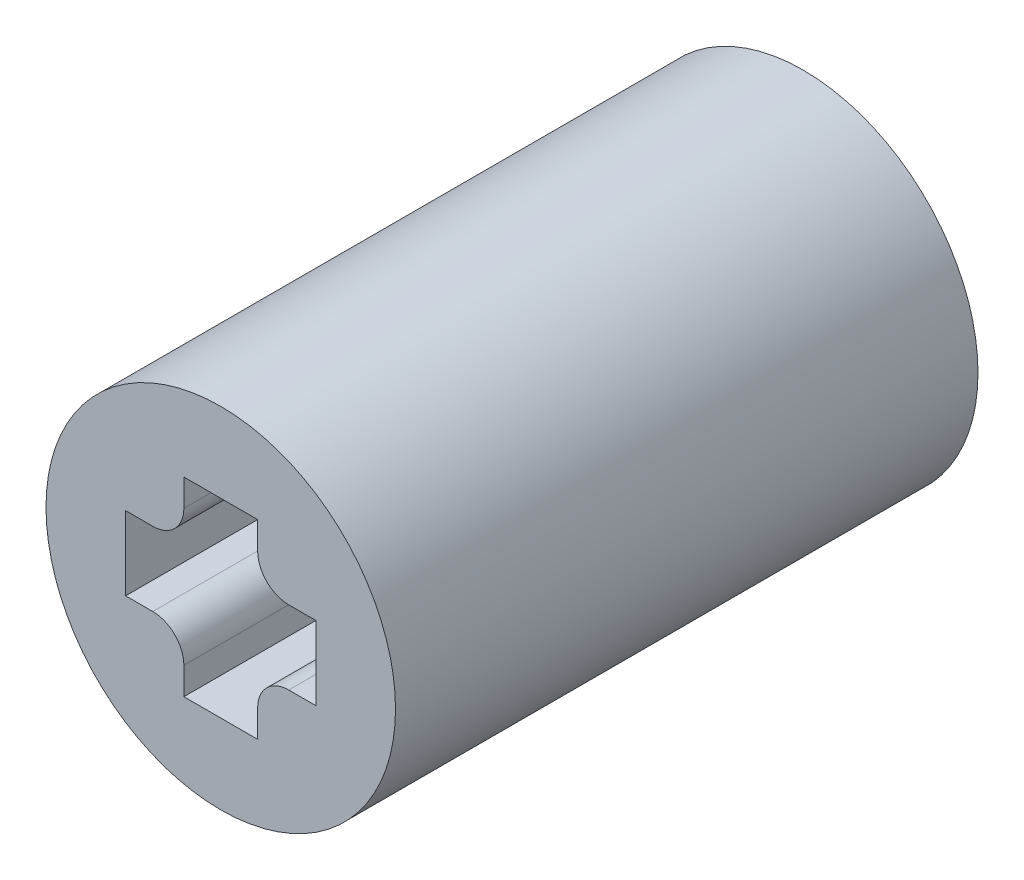
ISO-10303-21;
HEADER;
FILE_DESCRIPTION(('STEP AP214'),'2;1');
FILE_NAME('part.step','',(''),(''),'','','');
FILE_SCHEMA(('AUTOMOTIVE_DESIGN { 1 0 10303 214 1 1 1 1 }'));
ENDSEC;
DATA;
#1=APPLICATION_CONTEXT('core data for automotive mechanical design processes');
#2=APPLICATION_PROTOCOL_DEFINITION('international standard','automotive_design',2000,#1);
#3=PRODUCT_CONTEXT('',#1,'mechanical');
#4=PRODUCT('Part','Part','',(#3));
#5=PRODUCT_RELATED_PRODUCT_CATEGORY('part','',(#4));
#6=PRODUCT_DEFINITION_FORMATION('','',#4);
#7=PRODUCT_DEFINITION_CONTEXT('part definition',#1,'design');
#8=PRODUCT_DEFINITION('design','',#6,#7);
#9=PRODUCT_DEFINITION_SHAPE('','',#8);
#10=(LENGTH_UNIT() NAMED_UNIT(*) SI_UNIT(.MILLI.,.METRE.));
#11=(NAMED_UNIT(*) PLANE_ANGLE_UNIT() SI_UNIT($,.RADIAN.));
#12=(NAMED_UNIT(*) SI_UNIT($,.STERADIAN.) SOLID_ANGLE_UNIT());
#13=UNCERTAINTY_MEASURE_WITH_UNIT(LENGTH_MEASURE(1.E-05),#10,'distance_accuracy_value','');
#14=(GEOMETRIC_REPRESENTATION_CONTEXT(3) GLOBAL_UNCERTAINTY_ASSIGNED_CONTEXT((#13)) GLOBAL_UNIT_ASSIGNED_CONTEXT((#10,
#11,#12)) REPRESENTATION_CONTEXT('',''));
#15=CARTESIAN_POINT('',(0.,0.,0.));
#16=DIRECTION('',(0.,0.,1.));
#17=DIRECTION('',(1.,0.,0.));
#18=AXIS2_PLACEMENT_3D('',#15,#16,#17);
#19=CARTESIAN_POINT('',(0.,0.,15.));
#20=DIRECTION('',(0.,0.,-1.));
#21=DIRECTION('',(-1.,0.,0.));
#22=AXIS2_PLACEMENT_3D('',#19,#20,#21);
#23=CYLINDRICAL_SURFACE('',#22,4.5);
#24=CARTESIAN_POINT('',(0.,0.,15.));
#25=DIRECTION('',(0.,0.,1.));
#26=DIRECTION('',(1.,0.,0.));
#27=AXIS2_PLACEMENT_3D('',#24,#25,#26);
#28=CIRCLE('',#27,4.5);
#29=CARTESIAN_POINT('',(4.5,0.,15.));
#30=VERTEX_POINT('',#29);
#31=EDGE_CURVE('E297',#30,#30,#28,.T.);
#32=ORIENTED_EDGE('',*,*,#31,.F.);
#33=EDGE_LOOP('',(#32));
#34=FACE_BOUND('',#33,.T.);
#35=CARTESIAN_POINT('',(0.,0.,0.));
#36=DIRECTION('',(0.,0.,1.));
#37=DIRECTION('',(1.,0.,0.));
#38=AXIS2_PLACEMENT_3D('',#35,#36,#37);
#39=CIRCLE('',#38,4.5);
#40=CARTESIAN_POINT('',(4.5,0.,0.));
#41=VERTEX_POINT('',#40);
#42=EDGE_CURVE('E290',#41,#41,#39,.T.);
#43=ORIENTED_EDGE('',*,*,#42,.T.);
#44=EDGE_LOOP('',(#43));
#45=FACE_BOUND('',#44,.T.);
#46=ADVANCED_FACE('F33',(#34,#45),#23,.T.);
#47=CARTESIAN_POINT('',(0.,0.,15.));
#48=DIRECTION('',(0.,0.,1.));
#49=DIRECTION('',(1.,0.,0.));
#50=AXIS2_PLACEMENT_3D('',#47,#48,#49);
#51=PLANE('',#50);
#52=DIRECTION('',(0.,-1.,0.));
#53=VECTOR('',#52,1.);
#54=CARTESIAN_POINT('',(-0.949999999999999,-0.95,15.));
#55=LINE('',#54,#53);
#56=CARTESIAN_POINT('',(-0.949999999999999,-1.75,15.));
#57=VERTEX_POINT('',#56);
#58=CARTESIAN_POINT('',(-0.949999999999999,-2.45,15.));
#59=VERTEX_POINT('',#58);
#60=EDGE_CURVE('E241',#57,#59,#55,.T.);
#61=ORIENTED_EDGE('',*,*,#60,.F.);
#62=CARTESIAN_POINT('',(-1.75,-1.75,15.));
#63=DIRECTION('',(0.,0.,1.));
#64=DIRECTION('',(1.,0.,0.));
#65=AXIS2_PLACEMENT_3D('',#62,#63,#64);
#66=CIRCLE('',#65,0.8);
#67=CARTESIAN_POINT('',(-1.75,-0.95,15.));
#68=VERTEX_POINT('',#67);
#69=EDGE_CURVE('E311',#57,#68,#66,.T.);
#70=ORIENTED_EDGE('',*,*,#69,.T.);
#71=DIRECTION('',(1.,0.,0.));
#72=VECTOR('',#71,1.);
#73=CARTESIAN_POINT('',(-2.45,-0.95,15.));
#74=LINE('',#73,#72);
#75=CARTESIAN_POINT('',(-2.45,-0.95,15.));
#76=VERTEX_POINT('',#75);
#77=EDGE_CURVE('E238',#76,#68,#74,.T.);
#78=ORIENTED_EDGE('',*,*,#77,.F.);
#79=DIRECTION('',(0.,-1.,0.));
#80=VECTOR('',#79,1.);
#81=CARTESIAN_POINT('',(-2.45,0.95,15.));
#82=LINE('',#81,#80);
#83=CARTESIAN_POINT('',(-2.45,0.95,15.));
#84=VERTEX_POINT('',#83);
#85=EDGE_CURVE('E235',#84,#76,#82,.T.);
#86=ORIENTED_EDGE('',*,*,#85,.F.);
#87=DIRECTION('',(-1.,0.,0.));
#88=VECTOR('',#87,1.);
#89=CARTESIAN_POINT('',(-2.45,0.95,15.));
#90=LINE('',#89,#88);
#91=CARTESIAN_POINT('',(-1.75,0.95,15.));
#92=VERTEX_POINT('',#91);
#93=EDGE_CURVE('E233',#92,#84,#90,.T.);
#94=ORIENTED_EDGE('',*,*,#93,.F.);
#95=CARTESIAN_POINT('',(-1.75,1.75,15.));
#96=DIRECTION('',(0.,0.,1.));
#97=DIRECTION('',(1.,0.,0.));
#98=AXIS2_PLACEMENT_3D('',#95,#96,#97);
#99=CIRCLE('',#98,0.8);
#100=CARTESIAN_POINT('',(-0.949999999999999,1.75,15.));
#101=VERTEX_POINT('',#100);
#102=EDGE_CURVE('E307',#92,#101,#99,.T.);
#103=ORIENTED_EDGE('',*,*,#102,.T.);
#104=DIRECTION('',(0.,-1.,0.));
#105=VECTOR('',#104,1.);
#106=CARTESIAN_POINT('',(-0.949999999999999,2.45,15.));
#107=LINE('',#106,#105);
#108=CARTESIAN_POINT('',(-0.949999999999999,2.45,15.));
#109=VERTEX_POINT('',#108);
#110=EDGE_CURVE('E230',#109,#101,#107,.T.);
#111=ORIENTED_EDGE('',*,*,#110,.F.);
#112=DIRECTION('',(-1.,0.,0.));
#113=VECTOR('',#112,1.);
#114=CARTESIAN_POINT('',(-0.949999999999999,2.45,15.));
#115=LINE('',#114,#113);
#116=CARTESIAN_POINT('',(0.950000000000001,2.45,15.));
#117=VERTEX_POINT('',#116);
#118=EDGE_CURVE('E227',#117,#109,#115,.T.);
#119=ORIENTED_EDGE('',*,*,#118,.F.);
#120=DIRECTION('',(0.,1.,0.));
#121=VECTOR('',#120,1.);
#122=CARTESIAN_POINT('',(0.950000000000001,2.45,15.));
#123=LINE('',#122,#121);
#124=CARTESIAN_POINT('',(0.950000000000001,1.75,15.));
#125=VERTEX_POINT('',#124);
#126=EDGE_CURVE('E225',#125,#117,#123,.T.);
#127=ORIENTED_EDGE('',*,*,#126,.F.);
#128=CARTESIAN_POINT('',(1.75,1.75,15.));
#129=DIRECTION('',(0.,0.,1.));
#130=DIRECTION('',(1.,0.,0.));
#131=AXIS2_PLACEMENT_3D('',#128,#129,#130);
#132=CIRCLE('',#131,0.8);
#133=CARTESIAN_POINT('',(1.75,0.95,15.));
#134=VERTEX_POINT('',#133);
#135=EDGE_CURVE('E305',#125,#134,#132,.T.);
#136=ORIENTED_EDGE('',*,*,#135,.T.);
#137=DIRECTION('',(-1.,0.,0.));
#138=VECTOR('',#137,1.);
#139=CARTESIAN_POINT('',(0.950000000000001,0.95,15.));
#140=LINE('',#139,#138);
#141=CARTESIAN_POINT('',(2.45,0.95,15.));
#142=VERTEX_POINT('',#141);
#143=EDGE_CURVE('E223',#142,#134,#140,.T.);
#144=ORIENTED_EDGE('',*,*,#143,.F.);
#145=DIRECTION('',(0.,1.,0.));
#146=VECTOR('',#145,1.);
#147=CARTESIAN_POINT('',(2.45,0.95,15.));
#148=LINE('',#147,#146);
#149=CARTESIAN_POINT('',(2.45,-0.95,15.));
#150=VERTEX_POINT('',#149);
#151=EDGE_CURVE('E221',#150,#142,#148,.T.);
#152=ORIENTED_EDGE('',*,*,#151,.F.);
#153=DIRECTION('',(1.,0.,0.));
#154=VECTOR('',#153,1.);
#155=CARTESIAN_POINT('',(0.950000000000001,-0.95,15.));
#156=LINE('',#155,#154);
#157=CARTESIAN_POINT('',(1.75,-0.95,15.));
#158=VERTEX_POINT('',#157);
#159=EDGE_CURVE('E186',#158,#150,#156,.T.);
#160=ORIENTED_EDGE('',*,*,#159,.F.);
#161=CARTESIAN_POINT('',(1.75,-1.75,15.));
#162=DIRECTION('',(0.,0.,1.));
#163=DIRECTION('',(1.,0.,0.));
#164=AXIS2_PLACEMENT_3D('',#161,#162,#163);
#165=CIRCLE('',#164,0.8);
#166=CARTESIAN_POINT('',(0.950000000000001,-1.75,15.));
#167=VERTEX_POINT('',#166);
#168=EDGE_CURVE('E309',#158,#167,#165,.T.);
#169=ORIENTED_EDGE('',*,*,#168,.T.);
#170=DIRECTION('',(0.,1.,0.));
#171=VECTOR('',#170,1.);
#172=CARTESIAN_POINT('',(0.950000000000001,-0.95,15.));
#173=LINE('',#172,#171);
#174=CARTESIAN_POINT('',(0.950000000000002,-2.45,15.));
#175=VERTEX_POINT('',#174);
#176=EDGE_CURVE('E180',#175,#167,#173,.T.);
#177=ORIENTED_EDGE('',*,*,#176,.F.);
#178=DIRECTION('',(1.,0.,0.));
#179=VECTOR('',#178,1.);
#180=CARTESIAN_POINT('',(-0.949999999999999,-2.45,15.));
#181=LINE('',#180,#179);
#182=EDGE_CURVE('E243',#59,#175,#181,.T.);
#183=ORIENTED_EDGE('',*,*,#182,.F.);
#184=EDGE_LOOP('',(#61,#70,#78,#86,#94,#103,#111,#119,#127,#136,#144,#152,#160,#169,#177,#183));
#185=FACE_BOUND('',#184,.T.);
#186=ORIENTED_EDGE('',*,*,#31,.T.);
#187=EDGE_LOOP('',(#186));
#188=FACE_BOUND('',#187,.T.);
#189=ADVANCED_FACE('F345',(#185,#188),#51,.T.);
#190=CARTESIAN_POINT('',(0.,0.,0.));
#191=DIRECTION('',(0.,0.,1.));
#192=DIRECTION('',(1.,0.,0.));
#193=AXIS2_PLACEMENT_3D('',#190,#191,#192);
#194=PLANE('',#193);
#195=DIRECTION('',(1.,0.,0.));
#196=VECTOR('',#195,1.);
#197=CARTESIAN_POINT('',(2.,3.,0.));
#198=LINE('',#197,#196);
#199=CARTESIAN_POINT('',(-2.,3.,0.));
#200=VERTEX_POINT('',#199);
#201=CARTESIAN_POINT('',(2.,3.,0.));
#202=VERTEX_POINT('',#201);
#203=EDGE_CURVE('E280',#200,#202,#198,.T.);
#204=ORIENTED_EDGE('',*,*,#203,.F.);
#205=DIRECTION('',(0.,1.,0.));
#206=VECTOR('',#205,1.);
#207=CARTESIAN_POINT('',(-2.,3.,0.));
#208=LINE('',#207,#206);
#209=CARTESIAN_POINT('',(-2.,-3.,0.));
#210=VERTEX_POINT('',#209);
#211=EDGE_CURVE('E250',#210,#200,#208,.T.);
#212=ORIENTED_EDGE('',*,*,#211,.F.);
#213=DIRECTION('',(-1.,0.,0.));
#214=VECTOR('',#213,1.);
#215=CARTESIAN_POINT('',(2.,-3.,0.));
#216=LINE('',#215,#214);
#217=CARTESIAN_POINT('',(2.,-3.,0.));
#218=VERTEX_POINT('',#217);
#219=EDGE_CURVE('E269',#218,#210,#216,.T.);
#220=ORIENTED_EDGE('',*,*,#219,.F.);
#221=DIRECTION('',(0.,-1.,0.));
#222=VECTOR('',#221,1.);
#223=CARTESIAN_POINT('',(2.,3.,0.));
#224=LINE('',#223,#222);
#225=EDGE_CURVE('E283',#202,#218,#224,.T.);
#226=ORIENTED_EDGE('',*,*,#225,.F.);
#227=EDGE_LOOP('',(#204,#212,#220,#226));
#228=FACE_BOUND('',#227,.T.);
#229=ORIENTED_EDGE('',*,*,#42,.F.);
#230=EDGE_LOOP('',(#229));
#231=FACE_BOUND('',#230,.T.);
#232=ADVANCED_FACE('F372',(#228,#231),#194,.F.);
#233=CARTESIAN_POINT('',(-2.,3.,7.));
#234=DIRECTION('',(-1.,0.,0.));
#235=DIRECTION('',(0.,-1.,0.));
#236=AXIS2_PLACEMENT_3D('',#233,#234,#235);
#237=PLANE('',#236);
#238=ORIENTED_EDGE('',*,*,#211,.T.);
#239=DIRECTION('',(0.,0.,-1.));
#240=VECTOR('',#239,1.);
#241=CARTESIAN_POINT('',(-2.,3.,7.));
#242=LINE('',#241,#240);
#243=CARTESIAN_POINT('',(-2.,3.,7.));
#244=VERTEX_POINT('',#243);
#245=EDGE_CURVE('E278',#244,#200,#242,.T.);
#246=ORIENTED_EDGE('',*,*,#245,.F.);
#247=DIRECTION('',(0.,1.,0.));
#248=VECTOR('',#247,1.);
#249=CARTESIAN_POINT('',(-2.,3.,7.));
#250=LINE('',#249,#248);
#251=CARTESIAN_POINT('',(-2.,-3.,7.));
#252=VERTEX_POINT('',#251);
#253=EDGE_CURVE('E265',#252,#244,#250,.T.);
#254=ORIENTED_EDGE('',*,*,#253,.F.);
#255=DIRECTION('',(0.,0.,-1.));
#256=VECTOR('',#255,1.);
#257=CARTESIAN_POINT('',(-2.,-3.,7.));
#258=LINE('',#257,#256);
#259=EDGE_CURVE('E288',#252,#210,#258,.T.);
#260=ORIENTED_EDGE('',*,*,#259,.T.);
#261=EDGE_LOOP('',(#238,#246,#254,#260));
#262=FACE_BOUND('',#261,.T.);
#263=ADVANCED_FACE('F411',(#262),#237,.F.);
#264=CARTESIAN_POINT('',(2.,-3.,7.));
#265=DIRECTION('',(0.,-1.,0.));
#266=DIRECTION('',(0.,0.,-1.));
#267=AXIS2_PLACEMENT_3D('',#264,#265,#266);
#268=PLANE('',#267);
#269=ORIENTED_EDGE('',*,*,#219,.T.);
#270=ORIENTED_EDGE('',*,*,#259,.F.);
#271=DIRECTION('',(-1.,0.,0.));
#272=VECTOR('',#271,1.);
#273=CARTESIAN_POINT('',(2.,-3.,7.));
#274=LINE('',#273,#272);
#275=CARTESIAN_POINT('',(2.,-3.,7.));
#276=VERTEX_POINT('',#275);
#277=EDGE_CURVE('E275',#276,#252,#274,.T.);
#278=ORIENTED_EDGE('',*,*,#277,.F.);
#279=DIRECTION('',(0.,0.,-1.));
#280=VECTOR('',#279,1.);
#281=CARTESIAN_POINT('',(2.,-3.,7.));
#282=LINE('',#281,#280);
#283=EDGE_CURVE('E291',#276,#218,#282,.T.);
#284=ORIENTED_EDGE('',*,*,#283,.T.);
#285=EDGE_LOOP('',(#269,#270,#278,#284));
#286=FACE_BOUND('',#285,.T.);
#287=ADVANCED_FACE('F407',(#286),#268,.F.);
#288=CARTESIAN_POINT('',(2.,3.,7.));
#289=DIRECTION('',(1.,0.,0.));
#290=DIRECTION('',(0.,1.,0.));
#291=AXIS2_PLACEMENT_3D('',#288,#289,#290);
#292=PLANE('',#291);
#293=ORIENTED_EDGE('',*,*,#225,.T.);
#294=ORIENTED_EDGE('',*,*,#283,.F.);
#295=DIRECTION('',(0.,-1.,0.));
#296=VECTOR('',#295,1.);
#297=CARTESIAN_POINT('',(2.,3.,7.));
#298=LINE('',#297,#296);
#299=CARTESIAN_POINT('',(2.,3.,7.));
#300=VERTEX_POINT('',#299);
#301=EDGE_CURVE('E272',#300,#276,#298,.T.);
#302=ORIENTED_EDGE('',*,*,#301,.F.);
#303=DIRECTION('',(0.,0.,-1.));
#304=VECTOR('',#303,1.);
#305=CARTESIAN_POINT('',(2.,3.,7.));
#306=LINE('',#305,#304);
#307=EDGE_CURVE('E293',#300,#202,#306,.T.);
#308=ORIENTED_EDGE('',*,*,#307,.T.);
#309=EDGE_LOOP('',(#293,#294,#302,#308));
#310=FACE_BOUND('',#309,.T.);
#311=ADVANCED_FACE('F410',(#310),#292,.F.);
#312=CARTESIAN_POINT('',(2.,3.,7.));
#313=DIRECTION('',(0.,1.,0.));
#314=DIRECTION('',(0.,0.,1.));
#315=AXIS2_PLACEMENT_3D('',#312,#313,#314);
#316=PLANE('',#315);
#317=ORIENTED_EDGE('',*,*,#203,.T.);
#318=ORIENTED_EDGE('',*,*,#307,.F.);
#319=DIRECTION('',(1.,0.,0.));
#320=VECTOR('',#319,1.);
#321=CARTESIAN_POINT('',(2.,3.,7.));
#322=LINE('',#321,#320);
#323=EDGE_CURVE('E268',#244,#300,#322,.T.);
#324=ORIENTED_EDGE('',*,*,#323,.F.);
#325=ORIENTED_EDGE('',*,*,#245,.T.);
#326=EDGE_LOOP('',(#317,#318,#324,#325));
#327=FACE_BOUND('',#326,.T.);
#328=ADVANCED_FACE('F405',(#327),#316,.F.);
#329=CARTESIAN_POINT('',(0.,0.,7.));
#330=DIRECTION('',(0.,0.,-1.));
#331=DIRECTION('',(-1.,0.,0.));
#332=AXIS2_PLACEMENT_3D('',#329,#330,#331);
#333=PLANE('',#332);
#334=ORIENTED_EDGE('',*,*,#253,.T.);
#335=ORIENTED_EDGE('',*,*,#323,.T.);
#336=ORIENTED_EDGE('',*,*,#301,.T.);
#337=ORIENTED_EDGE('',*,*,#277,.T.);
#338=EDGE_LOOP('',(#334,#335,#336,#337));
#339=FACE_BOUND('',#338,.T.);
#340=ADVANCED_FACE('F402',(#339),#333,.T.);
#341=CARTESIAN_POINT('',(0.950000000000001,-0.95,8.00000000000001));
#342=DIRECTION('',(0.,-1.,0.));
#343=DIRECTION('',(0.,0.,-1.));
#344=AXIS2_PLACEMENT_3D('',#341,#342,#343);
#345=PLANE('',#344);
#346=DIRECTION('',(1.,0.,0.));
#347=VECTOR('',#346,1.);
#348=CARTESIAN_POINT('',(0.950000000000001,-0.95,8.00000000000001));
#349=LINE('',#348,#347);
#350=CARTESIAN_POINT('',(1.75,-0.95,8.00000000000001));
#351=VERTEX_POINT('',#350);
#352=CARTESIAN_POINT('',(2.45,-0.95,8.00000000000001));
#353=VERTEX_POINT('',#352);
#354=EDGE_CURVE('E169',#351,#353,#349,.T.);
#355=ORIENTED_EDGE('',*,*,#354,.F.);
#356=DIRECTION('',(0.,0.,1.));
#357=VECTOR('',#356,1.);
#358=CARTESIAN_POINT('',(1.75,-0.95,8.00000000000001));
#359=LINE('',#358,#357);
#360=EDGE_CURVE('E315',#351,#158,#359,.T.);
#361=ORIENTED_EDGE('',*,*,#360,.T.);
#362=ORIENTED_EDGE('',*,*,#159,.T.);
#363=DIRECTION('',(0.,0.,1.));
#364=VECTOR('',#363,1.);
#365=CARTESIAN_POINT('',(2.45,-0.95,8.00000000000001));
#366=LINE('',#365,#364);
#367=EDGE_CURVE('E183',#353,#150,#366,.T.);
#368=ORIENTED_EDGE('',*,*,#367,.F.);
#369=EDGE_LOOP('',(#355,#361,#362,#368));
#370=FACE_BOUND('',#369,.T.);
#371=ADVANCED_FACE('F184',(#370),#345,.F.);
#372=CARTESIAN_POINT('',(0.950000000000001,-0.95,8.00000000000001));
#373=DIRECTION('',(1.,0.,0.));
#374=DIRECTION('',(0.,1.,0.));
#375=AXIS2_PLACEMENT_3D('',#372,#373,#374);
#376=PLANE('',#375);
#377=ORIENTED_EDGE('',*,*,#176,.T.);
#378=DIRECTION('',(0.,0.,1.));
#379=VECTOR('',#378,1.);
#380=CARTESIAN_POINT('',(0.950000000000001,-1.75,8.00000000000001));
#381=LINE('',#380,#379);
#382=CARTESIAN_POINT('',(0.950000000000001,-1.75,8.00000000000001));
#383=VERTEX_POINT('',#382);
#384=EDGE_CURVE('E317',#167,#383,#381,.F.);
#385=ORIENTED_EDGE('',*,*,#384,.T.);
#386=DIRECTION('',(0.,1.,0.));
#387=VECTOR('',#386,1.);
#388=CARTESIAN_POINT('',(0.950000000000001,-0.95,8.00000000000001));
#389=LINE('',#388,#387);
#390=CARTESIAN_POINT('',(0.950000000000002,-2.45,8.00000000000001));
#391=VERTEX_POINT('',#390);
#392=EDGE_CURVE('E191',#391,#383,#389,.T.);
#393=ORIENTED_EDGE('',*,*,#392,.F.);
#394=DIRECTION('',(0.,0.,1.));
#395=VECTOR('',#394,1.);
#396=CARTESIAN_POINT('',(0.950000000000002,-2.45,8.00000000000001));
#397=LINE('',#396,#395);
#398=EDGE_CURVE('E248',#391,#175,#397,.T.);
#399=ORIENTED_EDGE('',*,*,#398,.T.);
#400=EDGE_LOOP('',(#377,#385,#393,#399));
#401=FACE_BOUND('',#400,.T.);
#402=ADVANCED_FACE('F401',(#401),#376,.F.);
#403=CARTESIAN_POINT('',(-0.949999999999999,-2.45,8.00000000000001));
#404=DIRECTION('',(0.,-1.,0.));
#405=DIRECTION('',(0.,0.,-1.));
#406=AXIS2_PLACEMENT_3D('',#403,#404,#405);
#407=PLANE('',#406);
#408=ORIENTED_EDGE('',*,*,#182,.T.);
#409=ORIENTED_EDGE('',*,*,#398,.F.);
#410=DIRECTION('',(1.,0.,0.));
#411=VECTOR('',#410,1.);
#412=CARTESIAN_POINT('',(-0.949999999999999,-2.45,8.00000000000001));
#413=LINE('',#412,#411);
#414=CARTESIAN_POINT('',(-0.949999999999999,-2.45,8.00000000000001));
#415=VERTEX_POINT('',#414);
#416=EDGE_CURVE('E216',#415,#391,#413,.T.);
#417=ORIENTED_EDGE('',*,*,#416,.F.);
#418=DIRECTION('',(0.,0.,1.));
#419=VECTOR('',#418,1.);
#420=CARTESIAN_POINT('',(-0.949999999999999,-2.45,8.00000000000001));
#421=LINE('',#420,#419);
#422=EDGE_CURVE('E251',#415,#59,#421,.T.);
#423=ORIENTED_EDGE('',*,*,#422,.T.);
#424=EDGE_LOOP('',(#408,#409,#417,#423));
#425=FACE_BOUND('',#424,.T.);
#426=ADVANCED_FACE('F462',(#425),#407,.F.);
#427=CARTESIAN_POINT('',(-0.949999999999999,-0.95,8.00000000000001));
#428=DIRECTION('',(-1.,0.,0.));
#429=DIRECTION('',(0.,-1.,0.));
#430=AXIS2_PLACEMENT_3D('',#427,#428,#429);
#431=PLANE('',#430);
#432=DIRECTION('',(0.,-1.,0.));
#433=VECTOR('',#432,1.);
#434=CARTESIAN_POINT('',(-0.949999999999999,-0.95,8.00000000000001));
#435=LINE('',#434,#433);
#436=CARTESIAN_POINT('',(-0.949999999999999,-1.75,8.00000000000001));
#437=VERTEX_POINT('',#436);
#438=EDGE_CURVE('E214',#437,#415,#435,.T.);
#439=ORIENTED_EDGE('',*,*,#438,.F.);
#440=DIRECTION('',(0.,0.,1.));
#441=VECTOR('',#440,1.);
#442=CARTESIAN_POINT('',(-0.949999999999999,-1.75,8.00000000000001));
#443=LINE('',#442,#441);
#444=EDGE_CURVE('E300',#437,#57,#443,.T.);
#445=ORIENTED_EDGE('',*,*,#444,.T.);
#446=ORIENTED_EDGE('',*,*,#60,.T.);
#447=ORIENTED_EDGE('',*,*,#422,.F.);
#448=EDGE_LOOP('',(#439,#445,#446,#447));
#449=FACE_BOUND('',#448,.T.);
#450=ADVANCED_FACE('F470',(#449),#431,.F.);
#451=CARTESIAN_POINT('',(-2.45,-0.95,8.00000000000001));
#452=DIRECTION('',(0.,-1.,0.));
#453=DIRECTION('',(0.,0.,-1.));
#454=AXIS2_PLACEMENT_3D('',#451,#452,#453);
#455=PLANE('',#454);
#456=ORIENTED_EDGE('',*,*,#77,.T.);
#457=DIRECTION('',(0.,0.,1.));
#458=VECTOR('',#457,1.);
#459=CARTESIAN_POINT('',(-1.75,-0.95,8.00000000000001));
#460=LINE('',#459,#458);
#461=CARTESIAN_POINT('',(-1.75,-0.95,8.00000000000001));
#462=VERTEX_POINT('',#461);
#463=EDGE_CURVE('E313',#68,#462,#460,.F.);
#464=ORIENTED_EDGE('',*,*,#463,.T.);
#465=DIRECTION('',(1.,0.,0.));
#466=VECTOR('',#465,1.);
#467=CARTESIAN_POINT('',(-2.45,-0.95,8.00000000000001));
#468=LINE('',#467,#466);
#469=CARTESIAN_POINT('',(-2.45,-0.95,8.00000000000001));
#470=VERTEX_POINT('',#469);
#471=EDGE_CURVE('E211',#470,#462,#468,.T.);
#472=ORIENTED_EDGE('',*,*,#471,.F.);
#473=DIRECTION('',(0.,0.,1.));
#474=VECTOR('',#473,1.);
#475=CARTESIAN_POINT('',(-2.45,-0.95,8.00000000000001));
#476=LINE('',#475,#474);
#477=EDGE_CURVE('E254',#470,#76,#476,.T.);
#478=ORIENTED_EDGE('',*,*,#477,.T.);
#479=EDGE_LOOP('',(#456,#464,#472,#478));
#480=FACE_BOUND('',#479,.T.);
#481=ADVANCED_FACE('F475',(#480),#455,.F.);
#482=CARTESIAN_POINT('',(-2.45,0.95,8.00000000000001));
#483=DIRECTION('',(-1.,0.,0.));
#484=DIRECTION('',(0.,-1.,0.));
#485=AXIS2_PLACEMENT_3D('',#482,#483,#484);
#486=PLANE('',#485);
#487=ORIENTED_EDGE('',*,*,#85,.T.);
#488=ORIENTED_EDGE('',*,*,#477,.F.);
#489=DIRECTION('',(0.,-1.,0.));
#490=VECTOR('',#489,1.);
#491=CARTESIAN_POINT('',(-2.45,0.95,8.00000000000001));
#492=LINE('',#491,#490);
#493=CARTESIAN_POINT('',(-2.45,0.95,8.00000000000001));
#494=VERTEX_POINT('',#493);
#495=EDGE_CURVE('E208',#494,#470,#492,.T.);
#496=ORIENTED_EDGE('',*,*,#495,.F.);
#497=DIRECTION('',(0.,0.,1.));
#498=VECTOR('',#497,1.);
#499=CARTESIAN_POINT('',(-2.45,0.95,8.00000000000001));
#500=LINE('',#499,#498);
#501=EDGE_CURVE('E256',#494,#84,#500,.T.);
#502=ORIENTED_EDGE('',*,*,#501,.T.);
#503=EDGE_LOOP('',(#487,#488,#496,#502));
#504=FACE_BOUND('',#503,.T.);
#505=ADVANCED_FACE('F485',(#504),#486,.F.);
#506=CARTESIAN_POINT('',(-2.45,0.95,8.00000000000001));
#507=DIRECTION('',(0.,1.,0.));
#508=DIRECTION('',(-1.,0.,0.));
#509=AXIS2_PLACEMENT_3D('',#506,#507,#508);
#510=PLANE('',#509);
#511=DIRECTION('',(-1.,0.,0.));
#512=VECTOR('',#511,1.);
#513=CARTESIAN_POINT('',(-2.45,0.95,8.00000000000001));
#514=LINE('',#513,#512);
#515=CARTESIAN_POINT('',(-1.75,0.95,8.00000000000001));
#516=VERTEX_POINT('',#515);
#517=EDGE_CURVE('E206',#516,#494,#514,.T.);
#518=ORIENTED_EDGE('',*,*,#517,.F.);
#519=DIRECTION('',(0.,0.,1.));
#520=VECTOR('',#519,1.);
#521=CARTESIAN_POINT('',(-1.75,0.95,8.00000000000001));
#522=LINE('',#521,#520);
#523=EDGE_CURVE('E319',#516,#92,#522,.T.);
#524=ORIENTED_EDGE('',*,*,#523,.T.);
#525=ORIENTED_EDGE('',*,*,#93,.T.);
#526=ORIENTED_EDGE('',*,*,#501,.F.);
#527=EDGE_LOOP('',(#518,#524,#525,#526));
#528=FACE_BOUND('',#527,.T.);
#529=ADVANCED_FACE('F338',(#528),#510,.F.);
#530=CARTESIAN_POINT('',(-0.949999999999999,2.45,8.00000000000001));
#531=DIRECTION('',(-1.,0.,0.));
#532=DIRECTION('',(0.,-1.,0.));
#533=AXIS2_PLACEMENT_3D('',#530,#531,#532);
#534=PLANE('',#533);
#535=ORIENTED_EDGE('',*,*,#110,.T.);
#536=DIRECTION('',(0.,0.,1.));
#537=VECTOR('',#536,1.);
#538=CARTESIAN_POINT('',(-0.949999999999999,1.75,8.00000000000001));
#539=LINE('',#538,#537);
#540=CARTESIAN_POINT('',(-0.949999999999999,1.75,8.00000000000001));
#541=VERTEX_POINT('',#540);
#542=EDGE_CURVE('E322',#101,#541,#539,.F.);
#543=ORIENTED_EDGE('',*,*,#542,.T.);
#544=DIRECTION('',(0.,-1.,0.));
#545=VECTOR('',#544,1.);
#546=CARTESIAN_POINT('',(-0.949999999999999,2.45,8.00000000000001));
#547=LINE('',#546,#545);
#548=CARTESIAN_POINT('',(-0.949999999999999,2.45,8.00000000000001));
#549=VERTEX_POINT('',#548);
#550=EDGE_CURVE('E203',#549,#541,#547,.T.);
#551=ORIENTED_EDGE('',*,*,#550,.F.);
#552=DIRECTION('',(0.,0.,1.));
#553=VECTOR('',#552,1.);
#554=CARTESIAN_POINT('',(-0.949999999999999,2.45,8.00000000000001));
#555=LINE('',#554,#553);
#556=EDGE_CURVE('E259',#549,#109,#555,.T.);
#557=ORIENTED_EDGE('',*,*,#556,.T.);
#558=EDGE_LOOP('',(#535,#543,#551,#557));
#559=FACE_BOUND('',#558,.T.);
#560=ADVANCED_FACE('F350',(#559),#534,.F.);
#561=CARTESIAN_POINT('',(-0.949999999999999,2.45,8.00000000000001));
#562=DIRECTION('',(0.,1.,0.));
#563=DIRECTION('',(0.,0.,1.));
#564=AXIS2_PLACEMENT_3D('',#561,#562,#563);
#565=PLANE('',#564);
#566=ORIENTED_EDGE('',*,*,#118,.T.);
#567=ORIENTED_EDGE('',*,*,#556,.F.);
#568=DIRECTION('',(-1.,0.,0.));
#569=VECTOR('',#568,1.);
#570=CARTESIAN_POINT('',(-0.949999999999999,2.45,8.00000000000001));
#571=LINE('',#570,#569);
#572=CARTESIAN_POINT('',(0.950000000000001,2.45,8.00000000000001));
#573=VERTEX_POINT('',#572);
#574=EDGE_CURVE('E200',#573,#549,#571,.T.);
#575=ORIENTED_EDGE('',*,*,#574,.F.);
#576=DIRECTION('',(0.,0.,1.));
#577=VECTOR('',#576,1.);
#578=CARTESIAN_POINT('',(0.950000000000001,2.45,8.00000000000001));
#579=LINE('',#578,#577);
#580=EDGE_CURVE('E261',#573,#117,#579,.T.);
#581=ORIENTED_EDGE('',*,*,#580,.T.);
#582=EDGE_LOOP('',(#566,#567,#575,#581));
#583=FACE_BOUND('',#582,.T.);
#584=ADVANCED_FACE('F353',(#583),#565,.F.);
#585=CARTESIAN_POINT('',(0.950000000000001,2.45,8.00000000000001));
#586=DIRECTION('',(1.,0.,0.));
#587=DIRECTION('',(0.,1.,0.));
#588=AXIS2_PLACEMENT_3D('',#585,#586,#587);
#589=PLANE('',#588);
#590=DIRECTION('',(0.,1.,0.));
#591=VECTOR('',#590,1.);
#592=CARTESIAN_POINT('',(0.950000000000001,2.45,8.00000000000001));
#593=LINE('',#592,#591);
#594=CARTESIAN_POINT('',(0.950000000000001,1.75,8.00000000000001));
#595=VERTEX_POINT('',#594);
#596=EDGE_CURVE('E196',#595,#573,#593,.T.);
#597=ORIENTED_EDGE('',*,*,#596,.F.);
#598=DIRECTION('',(0.,0.,1.));
#599=VECTOR('',#598,1.);
#600=CARTESIAN_POINT('',(0.950000000000001,1.75,8.00000000000001));
#601=LINE('',#600,#599);
#602=EDGE_CURVE('E324',#595,#125,#601,.T.);
#603=ORIENTED_EDGE('',*,*,#602,.T.);
#604=ORIENTED_EDGE('',*,*,#126,.T.);
#605=ORIENTED_EDGE('',*,*,#580,.F.);
#606=EDGE_LOOP('',(#597,#603,#604,#605));
#607=FACE_BOUND('',#606,.T.);
#608=ADVANCED_FACE('F358',(#607),#589,.F.);
#609=CARTESIAN_POINT('',(0.950000000000001,0.95,8.00000000000001));
#610=DIRECTION('',(0.,1.,0.));
#611=DIRECTION('',(-1.,0.,0.));
#612=AXIS2_PLACEMENT_3D('',#609,#610,#611);
#613=PLANE('',#612);
#614=ORIENTED_EDGE('',*,*,#143,.T.);
#615=DIRECTION('',(0.,0.,1.));
#616=VECTOR('',#615,1.);
#617=CARTESIAN_POINT('',(1.75,0.95,8.00000000000001));
#618=LINE('',#617,#616);
#619=CARTESIAN_POINT('',(1.75,0.95,8.00000000000001));
#620=VERTEX_POINT('',#619);
#621=EDGE_CURVE('E48',#134,#620,#618,.F.);
#622=ORIENTED_EDGE('',*,*,#621,.T.);
#623=DIRECTION('',(-1.,0.,0.));
#624=VECTOR('',#623,1.);
#625=CARTESIAN_POINT('',(0.950000000000001,0.95,8.00000000000001));
#626=LINE('',#625,#624);
#627=CARTESIAN_POINT('',(2.45,0.95,8.00000000000001));
#628=VERTEX_POINT('',#627);
#629=EDGE_CURVE('E194',#628,#620,#626,.T.);
#630=ORIENTED_EDGE('',*,*,#629,.F.);
#631=DIRECTION('',(0.,0.,1.));
#632=VECTOR('',#631,1.);
#633=CARTESIAN_POINT('',(2.45,0.95,8.00000000000001));
#634=LINE('',#633,#632);
#635=EDGE_CURVE('E190',#628,#142,#634,.T.);
#636=ORIENTED_EDGE('',*,*,#635,.T.);
#637=EDGE_LOOP('',(#614,#622,#630,#636));
#638=FACE_BOUND('',#637,.T.);
#639=ADVANCED_FACE('F388',(#638),#613,.F.);
#640=CARTESIAN_POINT('',(2.45,0.95,8.00000000000001));
#641=DIRECTION('',(1.,0.,0.));
#642=DIRECTION('',(0.,0.,-1.));
#643=AXIS2_PLACEMENT_3D('',#640,#641,#642);
#644=PLANE('',#643);
#645=ORIENTED_EDGE('',*,*,#151,.T.);
#646=ORIENTED_EDGE('',*,*,#635,.F.);
#647=DIRECTION('',(0.,1.,0.));
#648=VECTOR('',#647,1.);
#649=CARTESIAN_POINT('',(2.45,0.95,8.00000000000001));
#650=LINE('',#649,#648);
#651=EDGE_CURVE('E174',#353,#628,#650,.T.);
#652=ORIENTED_EDGE('',*,*,#651,.F.);
#653=ORIENTED_EDGE('',*,*,#367,.T.);
#654=EDGE_LOOP('',(#645,#646,#652,#653));
#655=FACE_BOUND('',#654,.T.);
#656=ADVANCED_FACE('F193',(#655),#644,.F.);
#657=CARTESIAN_POINT('',(0.,0.,8.00000000000001));
#658=DIRECTION('',(0.,0.,-1.));
#659=DIRECTION('',(-1.,0.,0.));
#660=AXIS2_PLACEMENT_3D('',#657,#658,#659);
#661=PLANE('',#660);
#662=ORIENTED_EDGE('',*,*,#392,.T.);
#663=CARTESIAN_POINT('',(1.75,-1.75,8.00000000000001));
#664=DIRECTION('',(0.,0.,-1.));
#665=DIRECTION('',(-1.,0.,0.));
#666=AXIS2_PLACEMENT_3D('',#663,#664,#665);
#667=CIRCLE('',#666,0.8);
#668=EDGE_CURVE('E176',#383,#351,#667,.T.);
#669=ORIENTED_EDGE('',*,*,#668,.T.);
#670=ORIENTED_EDGE('',*,*,#354,.T.);
#671=ORIENTED_EDGE('',*,*,#651,.T.);
#672=ORIENTED_EDGE('',*,*,#629,.T.);
#673=CARTESIAN_POINT('',(1.75,1.75,8.00000000000001));
#674=DIRECTION('',(0.,0.,-1.));
#675=DIRECTION('',(-1.,0.,0.));
#676=AXIS2_PLACEMENT_3D('',#673,#674,#675);
#677=CIRCLE('',#676,0.8);
#678=EDGE_CURVE('E11',#620,#595,#677,.T.);
#679=ORIENTED_EDGE('',*,*,#678,.T.);
#680=ORIENTED_EDGE('',*,*,#596,.T.);
#681=ORIENTED_EDGE('',*,*,#574,.T.);
#682=ORIENTED_EDGE('',*,*,#550,.T.);
#683=CARTESIAN_POINT('',(-1.75,1.75,8.00000000000001));
#684=DIRECTION('',(0.,0.,-1.));
#685=DIRECTION('',(-1.,0.,0.));
#686=AXIS2_PLACEMENT_3D('',#683,#684,#685);
#687=CIRCLE('',#686,0.8);
#688=EDGE_CURVE('E41',#541,#516,#687,.T.);
#689=ORIENTED_EDGE('',*,*,#688,.T.);
#690=ORIENTED_EDGE('',*,*,#517,.T.);
#691=ORIENTED_EDGE('',*,*,#495,.T.);
#692=ORIENTED_EDGE('',*,*,#471,.T.);
#693=CARTESIAN_POINT('',(-1.75,-1.75,8.00000000000001));
#694=DIRECTION('',(0.,0.,-1.));
#695=DIRECTION('',(-1.,0.,0.));
#696=AXIS2_PLACEMENT_3D('',#693,#694,#695);
#697=CIRCLE('',#696,0.8);
#698=EDGE_CURVE('E328',#462,#437,#697,.T.);
#699=ORIENTED_EDGE('',*,*,#698,.T.);
#700=ORIENTED_EDGE('',*,*,#438,.T.);
#701=ORIENTED_EDGE('',*,*,#416,.T.);
#702=EDGE_LOOP('',(#662,#669,#670,#671,#672,#679,#680,#681,#682,#689,#690,#691,#692,#699,#700,#701));
#703=FACE_BOUND('',#702,.T.);
#704=ADVANCED_FACE('F172',(#703),#661,.F.);
#705=CARTESIAN_POINT('',(-1.75,-1.75,8.00000000000001));
#706=DIRECTION('',(0.,0.,1.));
#707=DIRECTION('',(1.,0.,0.));
#708=AXIS2_PLACEMENT_3D('',#705,#706,#707);
#709=CYLINDRICAL_SURFACE('',#708,0.8);
#710=ORIENTED_EDGE('',*,*,#698,.F.);
#711=ORIENTED_EDGE('',*,*,#463,.F.);
#712=ORIENTED_EDGE('',*,*,#69,.F.);
#713=ORIENTED_EDGE('',*,*,#444,.F.);
#714=EDGE_LOOP('',(#710,#711,#712,#713));
#715=FACE_BOUND('',#714,.T.);
#716=ADVANCED_FACE('F378',(#715),#709,.T.);
#717=CARTESIAN_POINT('',(1.75,-1.75,8.00000000000001));
#718=DIRECTION('',(0.,0.,1.));
#719=DIRECTION('',(1.,0.,0.));
#720=AXIS2_PLACEMENT_3D('',#717,#718,#719);
#721=CYLINDRICAL_SURFACE('',#720,0.8);
#722=ORIENTED_EDGE('',*,*,#668,.F.);
#723=ORIENTED_EDGE('',*,*,#384,.F.);
#724=ORIENTED_EDGE('',*,*,#168,.F.);
#725=ORIENTED_EDGE('',*,*,#360,.F.);
#726=EDGE_LOOP('',(#722,#723,#724,#725));
#727=FACE_BOUND('',#726,.T.);
#728=ADVANCED_FACE('F365',(#727),#721,.T.);
#729=CARTESIAN_POINT('',(-1.75,1.75,8.00000000000001));
#730=DIRECTION('',(0.,0.,1.));
#731=DIRECTION('',(1.,0.,0.));
#732=AXIS2_PLACEMENT_3D('',#729,#730,#731);
#733=CYLINDRICAL_SURFACE('',#732,0.8);
#734=ORIENTED_EDGE('',*,*,#688,.F.);
#735=ORIENTED_EDGE('',*,*,#542,.F.);
#736=ORIENTED_EDGE('',*,*,#102,.F.);
#737=ORIENTED_EDGE('',*,*,#523,.F.);
#738=EDGE_LOOP('',(#734,#735,#736,#737));
#739=FACE_BOUND('',#738,.T.);
#740=ADVANCED_FACE('F341',(#739),#733,.T.);
#741=CARTESIAN_POINT('',(1.75,1.75,8.00000000000001));
#742=DIRECTION('',(0.,0.,1.));
#743=DIRECTION('',(1.,0.,0.));
#744=AXIS2_PLACEMENT_3D('',#741,#742,#743);
#745=CYLINDRICAL_SURFACE('',#744,0.8);
#746=ORIENTED_EDGE('',*,*,#678,.F.);
#747=ORIENTED_EDGE('',*,*,#621,.F.);
#748=ORIENTED_EDGE('',*,*,#135,.F.);
#749=ORIENTED_EDGE('',*,*,#602,.F.);
#750=EDGE_LOOP('',(#746,#747,#748,#749));
#751=FACE_BOUND('',#750,.T.);
#752=ADVANCED_FACE('F35',(#751),#745,.T.);
#753=CLOSED_SHELL('',(#46,#189,#232,#263,#287,#311,#328,#340,#371,#402,#426,#450,#481,#505,#529,
#560,#584,#608,#639,#656,#704,#716,#728,#740,#752));
#754=MANIFOLD_SOLID_BREP('B2',#753);
#755=ADVANCED_BREP_SHAPE_REPRESENTATION('',(#18,#754),#14);
#756=SHAPE_DEFINITION_REPRESENTATION(#9,#755);
ENDSEC;
END-ISO-10303-21;
